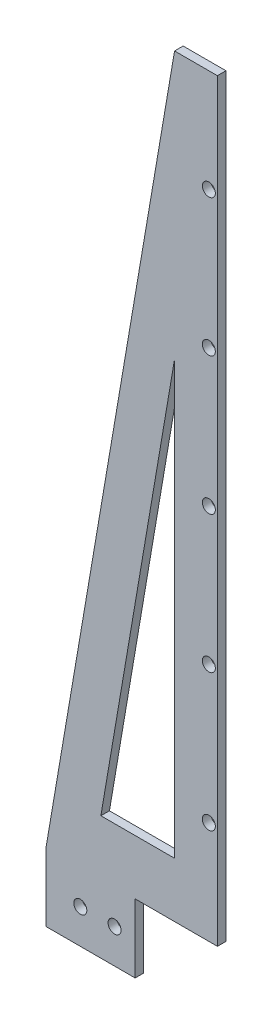
ISO-10303-21;
HEADER;
FILE_DESCRIPTION(('STEP AP214'),'2;1');
FILE_NAME('part.step','',(''),(''),'','','');
FILE_SCHEMA(('AUTOMOTIVE_DESIGN { 1 0 10303 214 1 1 1 1 }'));
ENDSEC;
DATA;
#1=APPLICATION_CONTEXT('core data for automotive mechanical design processes');
#2=APPLICATION_PROTOCOL_DEFINITION('international standard','automotive_design',2000,#1);
#3=PRODUCT_CONTEXT('',#1,'mechanical');
#4=PRODUCT('Part','Part','',(#3));
#5=PRODUCT_RELATED_PRODUCT_CATEGORY('part','',(#4));
#6=PRODUCT_DEFINITION_FORMATION('','',#4);
#7=PRODUCT_DEFINITION_CONTEXT('part definition',#1,'design');
#8=PRODUCT_DEFINITION('design','',#6,#7);
#9=PRODUCT_DEFINITION_SHAPE('','',#8);
#10=(LENGTH_UNIT() NAMED_UNIT(*) SI_UNIT(.MILLI.,.METRE.));
#11=(NAMED_UNIT(*) PLANE_ANGLE_UNIT() SI_UNIT($,.RADIAN.));
#12=(NAMED_UNIT(*) SI_UNIT($,.STERADIAN.) SOLID_ANGLE_UNIT());
#13=UNCERTAINTY_MEASURE_WITH_UNIT(LENGTH_MEASURE(1.E-05),#10,'distance_accuracy_value','');
#14=(GEOMETRIC_REPRESENTATION_CONTEXT(3) GLOBAL_UNCERTAINTY_ASSIGNED_CONTEXT((#13)) GLOBAL_UNIT_ASSIGNED_CONTEXT((#10,
#11,#12)) REPRESENTATION_CONTEXT('',''));
#15=CARTESIAN_POINT('',(0.,0.,0.));
#16=DIRECTION('',(0.,0.,1.));
#17=DIRECTION('',(1.,0.,0.));
#18=AXIS2_PLACEMENT_3D('',#15,#16,#17);
#19=CARTESIAN_POINT('',(0.,0.,3.175));
#20=DIRECTION('',(0.,0.,1.));
#21=DIRECTION('',(1.,0.,0.));
#22=AXIS2_PLACEMENT_3D('',#19,#20,#21);
#23=PLANE('',#22);
#24=CARTESIAN_POINT('',(60.3249999999997,165.1,3.175));
#25=DIRECTION('',(0.,0.,1.));
#26=DIRECTION('',(1.,0.,0.));
#27=AXIS2_PLACEMENT_3D('',#24,#25,#26);
#28=CIRCLE('',#27,2.41299999999999);
#29=CARTESIAN_POINT('',(62.7379999999997,165.1,3.175));
#30=VERTEX_POINT('',#29);
#31=EDGE_CURVE('E601',#30,#30,#28,.T.);
#32=ORIENTED_EDGE('',*,*,#31,.F.);
#33=EDGE_LOOP('',(#32));
#34=FACE_BOUND('',#33,.T.);
#35=CARTESIAN_POINT('',(60.325,63.5,3.175));
#36=DIRECTION('',(0.,0.,1.));
#37=DIRECTION('',(1.,0.,0.));
#38=AXIS2_PLACEMENT_3D('',#35,#36,#37);
#39=CIRCLE('',#38,2.41299999999999);
#40=CARTESIAN_POINT('',(62.738,63.5,3.175));
#41=VERTEX_POINT('',#40);
#42=EDGE_CURVE('E613',#41,#41,#39,.T.);
#43=ORIENTED_EDGE('',*,*,#42,.F.);
#44=EDGE_LOOP('',(#43));
#45=FACE_BOUND('',#44,.T.);
#46=CARTESIAN_POINT('',(25.4,12.7,3.175));
#47=DIRECTION('',(0.,0.,1.));
#48=DIRECTION('',(1.,0.,0.));
#49=AXIS2_PLACEMENT_3D('',#46,#47,#48);
#50=CIRCLE('',#49,2.413);
#51=CARTESIAN_POINT('',(27.813,12.7,3.175));
#52=VERTEX_POINT('',#51);
#53=EDGE_CURVE('E625',#52,#52,#50,.T.);
#54=ORIENTED_EDGE('',*,*,#53,.F.);
#55=EDGE_LOOP('',(#54));
#56=FACE_BOUND('',#55,.T.);
#57=DIRECTION('',(0.,1.,0.));
#58=VECTOR('',#57,1.);
#59=CARTESIAN_POINT('',(0.,0.,3.175));
#60=LINE('',#59,#58);
#61=CARTESIAN_POINT('',(0.,0.,3.175));
#62=VERTEX_POINT('',#61);
#63=CARTESIAN_POINT('',(0.,25.4,3.175));
#64=VERTEX_POINT('',#63);
#65=EDGE_CURVE('E342',#62,#64,#60,.T.);
#66=ORIENTED_EDGE('',*,*,#65,.F.);
#67=DIRECTION('',(1.,0.,0.));
#68=VECTOR('',#67,1.);
#69=CARTESIAN_POINT('',(0.,0.,3.175));
#70=LINE('',#69,#68);
#71=CARTESIAN_POINT('',(33.02,0.,3.175));
#72=VERTEX_POINT('',#71);
#73=EDGE_CURVE('E356',#62,#72,#70,.T.);
#74=ORIENTED_EDGE('',*,*,#73,.T.);
#75=DIRECTION('',(0.,1.,0.));
#76=VECTOR('',#75,1.);
#77=CARTESIAN_POINT('',(33.02,0.,3.175));
#78=LINE('',#77,#76);
#79=CARTESIAN_POINT('',(33.02,25.4,3.175));
#80=VERTEX_POINT('',#79);
#81=EDGE_CURVE('E354',#72,#80,#78,.T.);
#82=ORIENTED_EDGE('',*,*,#81,.T.);
#83=DIRECTION('',(1.,0.,0.));
#84=VECTOR('',#83,1.);
#85=CARTESIAN_POINT('',(33.02,25.4,3.175));
#86=LINE('',#85,#84);
#87=CARTESIAN_POINT('',(63.5,25.4,3.175));
#88=VERTEX_POINT('',#87);
#89=EDGE_CURVE('E352',#80,#88,#86,.T.);
#90=ORIENTED_EDGE('',*,*,#89,.T.);
#91=DIRECTION('',(0.,1.,0.));
#92=VECTOR('',#91,1.);
#93=CARTESIAN_POINT('',(63.5,25.4,3.175));
#94=LINE('',#93,#92);
#95=CARTESIAN_POINT('',(63.5,304.8,3.175));
#96=VERTEX_POINT('',#95);
#97=EDGE_CURVE('E350',#88,#96,#94,.T.);
#98=ORIENTED_EDGE('',*,*,#97,.T.);
#99=DIRECTION('',(-1.,0.,0.));
#100=VECTOR('',#99,1.);
#101=CARTESIAN_POINT('',(63.5,304.8,3.175));
#102=LINE('',#101,#100);
#103=CARTESIAN_POINT('',(47.625,304.8,3.175));
#104=VERTEX_POINT('',#103);
#105=EDGE_CURVE('E348',#96,#104,#102,.T.);
#106=ORIENTED_EDGE('',*,*,#105,.T.);
#107=DIRECTION('',(-0.168030974324044,-0.985781716034393,0.));
#108=VECTOR('',#107,1.);
#109=CARTESIAN_POINT('',(47.625,304.8,3.175));
#110=LINE('',#109,#108);
#111=EDGE_CURVE('E345',#104,#64,#110,.T.);
#112=ORIENTED_EDGE('',*,*,#111,.T.);
#113=EDGE_LOOP('',(#66,#74,#82,#90,#98,#106,#112));
#114=FACE_BOUND('',#113,.T.);
#115=DIRECTION('',(-1.,0.,0.));
#116=VECTOR('',#115,1.);
#117=CARTESIAN_POINT('',(47.625,45.72,3.175));
#118=LINE('',#117,#116);
#119=CARTESIAN_POINT('',(47.625,45.72,3.175));
#120=VERTEX_POINT('',#119);
#121=CARTESIAN_POINT('',(20.3199999999999,45.72,3.175));
#122=VERTEX_POINT('',#121);
#123=EDGE_CURVE('E313',#120,#122,#118,.T.);
#124=ORIENTED_EDGE('',*,*,#123,.T.);
#125=DIRECTION('',(0.168030974324052,0.985781716034392,0.));
#126=VECTOR('',#125,1.);
#127=CARTESIAN_POINT('',(20.3199999999999,45.72,3.175));
#128=LINE('',#127,#126);
#129=CARTESIAN_POINT('',(47.625,205.909333333327,3.175));
#130=VERTEX_POINT('',#129);
#131=EDGE_CURVE('E320',#122,#130,#128,.T.);
#132=ORIENTED_EDGE('',*,*,#131,.T.);
#133=DIRECTION('',(0.,-1.,0.));
#134=VECTOR('',#133,1.);
#135=CARTESIAN_POINT('',(47.625,205.909333333327,3.175));
#136=LINE('',#135,#134);
#137=EDGE_CURVE('E250',#130,#120,#136,.T.);
#138=ORIENTED_EDGE('',*,*,#137,.T.);
#139=EDGE_LOOP('',(#124,#132,#138));
#140=FACE_BOUND('',#139,.T.);
#141=CARTESIAN_POINT('',(12.7,12.7,3.175));
#142=DIRECTION('',(0.,0.,1.));
#143=DIRECTION('',(1.,0.,0.));
#144=AXIS2_PLACEMENT_3D('',#141,#142,#143);
#145=CIRCLE('',#144,2.413);
#146=CARTESIAN_POINT('',(15.113,12.7,3.175));
#147=VERTEX_POINT('',#146);
#148=EDGE_CURVE('E336',#147,#147,#145,.T.);
#149=ORIENTED_EDGE('',*,*,#148,.F.);
#150=EDGE_LOOP('',(#149));
#151=FACE_BOUND('',#150,.T.);
#152=CARTESIAN_POINT('',(60.3249999999998,114.3,3.175));
#153=DIRECTION('',(0.,0.,1.));
#154=DIRECTION('',(1.,0.,0.));
#155=AXIS2_PLACEMENT_3D('',#152,#153,#154);
#156=CIRCLE('',#155,2.41299999999999);
#157=CARTESIAN_POINT('',(62.7379999999998,114.3,3.175));
#158=VERTEX_POINT('',#157);
#159=EDGE_CURVE('E619',#158,#158,#156,.T.);
#160=ORIENTED_EDGE('',*,*,#159,.F.);
#161=EDGE_LOOP('',(#160));
#162=FACE_BOUND('',#161,.T.);
#163=CARTESIAN_POINT('',(60.3249999999995,215.9,3.175));
#164=DIRECTION('',(0.,0.,1.));
#165=DIRECTION('',(1.,0.,0.));
#166=AXIS2_PLACEMENT_3D('',#163,#164,#165);
#167=CIRCLE('',#166,2.41299999999999);
#168=CARTESIAN_POINT('',(62.7379999999995,215.9,3.175));
#169=VERTEX_POINT('',#168);
#170=EDGE_CURVE('E607',#169,#169,#167,.T.);
#171=ORIENTED_EDGE('',*,*,#170,.F.);
#172=EDGE_LOOP('',(#171));
#173=FACE_BOUND('',#172,.T.);
#174=CARTESIAN_POINT('',(60.3249999999993,266.7,3.175));
#175=DIRECTION('',(0.,0.,1.));
#176=DIRECTION('',(1.,0.,0.));
#177=AXIS2_PLACEMENT_3D('',#174,#175,#176);
#178=CIRCLE('',#177,2.413);
#179=CARTESIAN_POINT('',(62.7379999999993,266.7,3.175));
#180=VERTEX_POINT('',#179);
#181=EDGE_CURVE('E592',#180,#180,#178,.T.);
#182=ORIENTED_EDGE('',*,*,#181,.F.);
#183=EDGE_LOOP('',(#182));
#184=FACE_BOUND('',#183,.T.);
#185=ADVANCED_FACE('F233',(#34,#45,#56,#114,#140,#151,#162,#173,#184),#23,.T.);
#186=CARTESIAN_POINT('',(0.,0.,0.));
#187=DIRECTION('',(0.,0.,1.));
#188=DIRECTION('',(1.,0.,0.));
#189=AXIS2_PLACEMENT_3D('',#186,#187,#188);
#190=PLANE('',#189);
#191=DIRECTION('',(0.168030974324052,0.985781716034392,0.));
#192=VECTOR('',#191,1.);
#193=CARTESIAN_POINT('',(20.3199999999999,45.72,0.));
#194=LINE('',#193,#192);
#195=CARTESIAN_POINT('',(20.3199999999999,45.72,0.));
#196=VERTEX_POINT('',#195);
#197=CARTESIAN_POINT('',(47.625,205.909333333327,0.));
#198=VERTEX_POINT('',#197);
#199=EDGE_CURVE('E328',#196,#198,#194,.T.);
#200=ORIENTED_EDGE('',*,*,#199,.F.);
#201=DIRECTION('',(-1.,0.,0.));
#202=VECTOR('',#201,1.);
#203=CARTESIAN_POINT('',(47.625,45.72,0.));
#204=LINE('',#203,#202);
#205=CARTESIAN_POINT('',(47.625,45.72,0.));
#206=VERTEX_POINT('',#205);
#207=EDGE_CURVE('E258',#206,#196,#204,.T.);
#208=ORIENTED_EDGE('',*,*,#207,.F.);
#209=DIRECTION('',(0.,-1.,0.));
#210=VECTOR('',#209,1.);
#211=CARTESIAN_POINT('',(47.625,205.909333333327,0.));
#212=LINE('',#211,#210);
#213=EDGE_CURVE('E325',#198,#206,#212,.T.);
#214=ORIENTED_EDGE('',*,*,#213,.F.);
#215=EDGE_LOOP('',(#200,#208,#214));
#216=FACE_BOUND('',#215,.T.);
#217=DIRECTION('',(0.,1.,0.));
#218=VECTOR('',#217,1.);
#219=CARTESIAN_POINT('',(0.,0.,0.));
#220=LINE('',#219,#218);
#221=CARTESIAN_POINT('',(0.,0.,0.));
#222=VERTEX_POINT('',#221);
#223=CARTESIAN_POINT('',(0.,25.4,0.));
#224=VERTEX_POINT('',#223);
#225=EDGE_CURVE('E340',#222,#224,#220,.T.);
#226=ORIENTED_EDGE('',*,*,#225,.T.);
#227=DIRECTION('',(-0.168030974324044,-0.985781716034393,0.));
#228=VECTOR('',#227,1.);
#229=CARTESIAN_POINT('',(47.625,304.8,0.));
#230=LINE('',#229,#228);
#231=CARTESIAN_POINT('',(47.625,304.8,0.));
#232=VERTEX_POINT('',#231);
#233=EDGE_CURVE('E360',#232,#224,#230,.T.);
#234=ORIENTED_EDGE('',*,*,#233,.F.);
#235=DIRECTION('',(-1.,0.,0.));
#236=VECTOR('',#235,1.);
#237=CARTESIAN_POINT('',(63.5,304.8,0.));
#238=LINE('',#237,#236);
#239=CARTESIAN_POINT('',(63.5,304.8,0.));
#240=VERTEX_POINT('',#239);
#241=EDGE_CURVE('E363',#240,#232,#238,.T.);
#242=ORIENTED_EDGE('',*,*,#241,.F.);
#243=DIRECTION('',(0.,1.,0.));
#244=VECTOR('',#243,1.);
#245=CARTESIAN_POINT('',(63.5,25.4,0.));
#246=LINE('',#245,#244);
#247=CARTESIAN_POINT('',(63.5,25.4,0.));
#248=VERTEX_POINT('',#247);
#249=EDGE_CURVE('E365',#248,#240,#246,.T.);
#250=ORIENTED_EDGE('',*,*,#249,.F.);
#251=DIRECTION('',(1.,0.,0.));
#252=VECTOR('',#251,1.);
#253=CARTESIAN_POINT('',(33.02,25.4,0.));
#254=LINE('',#253,#252);
#255=CARTESIAN_POINT('',(33.02,25.4,0.));
#256=VERTEX_POINT('',#255);
#257=EDGE_CURVE('E367',#256,#248,#254,.T.);
#258=ORIENTED_EDGE('',*,*,#257,.F.);
#259=DIRECTION('',(0.,1.,0.));
#260=VECTOR('',#259,1.);
#261=CARTESIAN_POINT('',(33.02,0.,0.));
#262=LINE('',#261,#260);
#263=CARTESIAN_POINT('',(33.02,0.,0.));
#264=VERTEX_POINT('',#263);
#265=EDGE_CURVE('E369',#264,#256,#262,.T.);
#266=ORIENTED_EDGE('',*,*,#265,.F.);
#267=DIRECTION('',(1.,0.,0.));
#268=VECTOR('',#267,1.);
#269=CARTESIAN_POINT('',(0.,0.,0.));
#270=LINE('',#269,#268);
#271=EDGE_CURVE('E346',#222,#264,#270,.T.);
#272=ORIENTED_EDGE('',*,*,#271,.F.);
#273=EDGE_LOOP('',(#226,#234,#242,#250,#258,#266,#272));
#274=FACE_BOUND('',#273,.T.);
#275=CARTESIAN_POINT('',(12.7,12.7,0.));
#276=DIRECTION('',(0.,0.,1.));
#277=DIRECTION('',(1.,0.,0.));
#278=AXIS2_PLACEMENT_3D('',#275,#276,#277);
#279=CIRCLE('',#278,2.413);
#280=CARTESIAN_POINT('',(15.113,12.7,0.));
#281=VERTEX_POINT('',#280);
#282=EDGE_CURVE('E331',#281,#281,#279,.T.);
#283=ORIENTED_EDGE('',*,*,#282,.T.);
#284=EDGE_LOOP('',(#283));
#285=FACE_BOUND('',#284,.T.);
#286=CARTESIAN_POINT('',(25.4,12.7,0.));
#287=DIRECTION('',(0.,0.,1.));
#288=DIRECTION('',(1.,0.,0.));
#289=AXIS2_PLACEMENT_3D('',#286,#287,#288);
#290=CIRCLE('',#289,2.413);
#291=CARTESIAN_POINT('',(27.813,12.7,0.));
#292=VERTEX_POINT('',#291);
#293=EDGE_CURVE('E622',#292,#292,#290,.T.);
#294=ORIENTED_EDGE('',*,*,#293,.T.);
#295=EDGE_LOOP('',(#294));
#296=FACE_BOUND('',#295,.T.);
#297=CARTESIAN_POINT('',(60.3249999999998,114.3,0.));
#298=DIRECTION('',(0.,0.,1.));
#299=DIRECTION('',(1.,0.,0.));
#300=AXIS2_PLACEMENT_3D('',#297,#298,#299);
#301=CIRCLE('',#300,2.41299999999999);
#302=CARTESIAN_POINT('',(62.7379999999998,114.3,0.));
#303=VERTEX_POINT('',#302);
#304=EDGE_CURVE('E616',#303,#303,#301,.T.);
#305=ORIENTED_EDGE('',*,*,#304,.T.);
#306=EDGE_LOOP('',(#305));
#307=FACE_BOUND('',#306,.T.);
#308=CARTESIAN_POINT('',(60.325,63.5,0.));
#309=DIRECTION('',(0.,0.,1.));
#310=DIRECTION('',(1.,0.,0.));
#311=AXIS2_PLACEMENT_3D('',#308,#309,#310);
#312=CIRCLE('',#311,2.41299999999999);
#313=CARTESIAN_POINT('',(62.738,63.5,0.));
#314=VERTEX_POINT('',#313);
#315=EDGE_CURVE('E610',#314,#314,#312,.T.);
#316=ORIENTED_EDGE('',*,*,#315,.T.);
#317=EDGE_LOOP('',(#316));
#318=FACE_BOUND('',#317,.T.);
#319=CARTESIAN_POINT('',(60.3249999999995,215.9,0.));
#320=DIRECTION('',(0.,0.,1.));
#321=DIRECTION('',(1.,0.,0.));
#322=AXIS2_PLACEMENT_3D('',#319,#320,#321);
#323=CIRCLE('',#322,2.41299999999999);
#324=CARTESIAN_POINT('',(62.7379999999995,215.9,0.));
#325=VERTEX_POINT('',#324);
#326=EDGE_CURVE('E604',#325,#325,#323,.T.);
#327=ORIENTED_EDGE('',*,*,#326,.T.);
#328=EDGE_LOOP('',(#327));
#329=FACE_BOUND('',#328,.T.);
#330=CARTESIAN_POINT('',(60.3249999999997,165.1,0.));
#331=DIRECTION('',(0.,0.,1.));
#332=DIRECTION('',(1.,0.,0.));
#333=AXIS2_PLACEMENT_3D('',#330,#331,#332);
#334=CIRCLE('',#333,2.41299999999999);
#335=CARTESIAN_POINT('',(62.7379999999997,165.1,0.));
#336=VERTEX_POINT('',#335);
#337=EDGE_CURVE('E598',#336,#336,#334,.T.);
#338=ORIENTED_EDGE('',*,*,#337,.T.);
#339=EDGE_LOOP('',(#338));
#340=FACE_BOUND('',#339,.T.);
#341=CARTESIAN_POINT('',(60.3249999999993,266.7,0.));
#342=DIRECTION('',(0.,0.,1.));
#343=DIRECTION('',(1.,0.,0.));
#344=AXIS2_PLACEMENT_3D('',#341,#342,#343);
#345=CIRCLE('',#344,2.413);
#346=CARTESIAN_POINT('',(62.7379999999993,266.7,0.));
#347=VERTEX_POINT('',#346);
#348=EDGE_CURVE('E595',#347,#347,#345,.T.);
#349=ORIENTED_EDGE('',*,*,#348,.T.);
#350=EDGE_LOOP('',(#349));
#351=FACE_BOUND('',#350,.T.);
#352=ADVANCED_FACE('F396',(#216,#274,#285,#296,#307,#318,#329,#340,#351),#190,.F.);
#353=CARTESIAN_POINT('',(0.,0.,3.175));
#354=DIRECTION('',(-1.,0.,0.));
#355=DIRECTION('',(0.,0.,1.));
#356=AXIS2_PLACEMENT_3D('',#353,#354,#355);
#357=PLANE('',#356);
#358=ORIENTED_EDGE('',*,*,#225,.F.);
#359=DIRECTION('',(0.,0.,-1.));
#360=VECTOR('',#359,1.);
#361=CARTESIAN_POINT('',(0.,0.,3.175));
#362=LINE('',#361,#360);
#363=EDGE_CURVE('E12',#62,#222,#362,.T.);
#364=ORIENTED_EDGE('',*,*,#363,.F.);
#365=ORIENTED_EDGE('',*,*,#65,.T.);
#366=DIRECTION('',(0.,0.,-1.));
#367=VECTOR('',#366,1.);
#368=CARTESIAN_POINT('',(0.,25.4,3.175));
#369=LINE('',#368,#367);
#370=EDGE_CURVE('E237',#64,#224,#369,.T.);
#371=ORIENTED_EDGE('',*,*,#370,.T.);
#372=EDGE_LOOP('',(#358,#364,#365,#371));
#373=FACE_BOUND('',#372,.T.);
#374=ADVANCED_FACE('F235',(#373),#357,.T.);
#375=CARTESIAN_POINT('',(0.,0.,3.175));
#376=DIRECTION('',(0.,1.,0.));
#377=DIRECTION('',(0.,0.,1.));
#378=AXIS2_PLACEMENT_3D('',#375,#376,#377);
#379=PLANE('',#378);
#380=ORIENTED_EDGE('',*,*,#271,.T.);
#381=DIRECTION('',(0.,0.,-1.));
#382=VECTOR('',#381,1.);
#383=CARTESIAN_POINT('',(33.02,0.,3.175));
#384=LINE('',#383,#382);
#385=EDGE_CURVE('E242',#72,#264,#384,.T.);
#386=ORIENTED_EDGE('',*,*,#385,.F.);
#387=ORIENTED_EDGE('',*,*,#73,.F.);
#388=ORIENTED_EDGE('',*,*,#363,.T.);
#389=EDGE_LOOP('',(#380,#386,#387,#388));
#390=FACE_BOUND('',#389,.T.);
#391=ADVANCED_FACE('F402',(#390),#379,.F.);
#392=CARTESIAN_POINT('',(33.02,0.,3.175));
#393=DIRECTION('',(-1.,0.,0.));
#394=DIRECTION('',(0.,0.,1.));
#395=AXIS2_PLACEMENT_3D('',#392,#393,#394);
#396=PLANE('',#395);
#397=ORIENTED_EDGE('',*,*,#265,.T.);
#398=DIRECTION('',(0.,0.,-1.));
#399=VECTOR('',#398,1.);
#400=CARTESIAN_POINT('',(33.02,25.4,3.175));
#401=LINE('',#400,#399);
#402=EDGE_CURVE('E374',#80,#256,#401,.T.);
#403=ORIENTED_EDGE('',*,*,#402,.F.);
#404=ORIENTED_EDGE('',*,*,#81,.F.);
#405=ORIENTED_EDGE('',*,*,#385,.T.);
#406=EDGE_LOOP('',(#397,#403,#404,#405));
#407=FACE_BOUND('',#406,.T.);
#408=ADVANCED_FACE('F406',(#407),#396,.F.);
#409=CARTESIAN_POINT('',(33.02,25.4,3.175));
#410=DIRECTION('',(0.,1.,0.));
#411=DIRECTION('',(-1.,0.,0.));
#412=AXIS2_PLACEMENT_3D('',#409,#410,#411);
#413=PLANE('',#412);
#414=ORIENTED_EDGE('',*,*,#257,.T.);
#415=DIRECTION('',(0.,0.,-1.));
#416=VECTOR('',#415,1.);
#417=CARTESIAN_POINT('',(63.5,25.4,3.175));
#418=LINE('',#417,#416);
#419=EDGE_CURVE('E377',#88,#248,#418,.T.);
#420=ORIENTED_EDGE('',*,*,#419,.F.);
#421=ORIENTED_EDGE('',*,*,#89,.F.);
#422=ORIENTED_EDGE('',*,*,#402,.T.);
#423=EDGE_LOOP('',(#414,#420,#421,#422));
#424=FACE_BOUND('',#423,.T.);
#425=ADVANCED_FACE('F420',(#424),#413,.F.);
#426=CARTESIAN_POINT('',(63.5,25.4,3.175));
#427=DIRECTION('',(-1.,0.,0.));
#428=DIRECTION('',(0.,0.,1.));
#429=AXIS2_PLACEMENT_3D('',#426,#427,#428);
#430=PLANE('',#429);
#431=ORIENTED_EDGE('',*,*,#249,.T.);
#432=DIRECTION('',(0.,0.,-1.));
#433=VECTOR('',#432,1.);
#434=CARTESIAN_POINT('',(63.5,304.8,3.175));
#435=LINE('',#434,#433);
#436=EDGE_CURVE('E380',#96,#240,#435,.T.);
#437=ORIENTED_EDGE('',*,*,#436,.F.);
#438=ORIENTED_EDGE('',*,*,#97,.F.);
#439=ORIENTED_EDGE('',*,*,#419,.T.);
#440=EDGE_LOOP('',(#431,#437,#438,#439));
#441=FACE_BOUND('',#440,.T.);
#442=ADVANCED_FACE('F418',(#441),#430,.F.);
#443=CARTESIAN_POINT('',(63.5,304.8,3.175));
#444=DIRECTION('',(0.,-1.,0.));
#445=DIRECTION('',(0.,0.,-1.));
#446=AXIS2_PLACEMENT_3D('',#443,#444,#445);
#447=PLANE('',#446);
#448=ORIENTED_EDGE('',*,*,#241,.T.);
#449=DIRECTION('',(0.,0.,-1.));
#450=VECTOR('',#449,1.);
#451=CARTESIAN_POINT('',(47.625,304.8,3.175));
#452=LINE('',#451,#450);
#453=EDGE_CURVE('E382',#104,#232,#452,.T.);
#454=ORIENTED_EDGE('',*,*,#453,.F.);
#455=ORIENTED_EDGE('',*,*,#105,.F.);
#456=ORIENTED_EDGE('',*,*,#436,.T.);
#457=EDGE_LOOP('',(#448,#454,#455,#456));
#458=FACE_BOUND('',#457,.T.);
#459=ADVANCED_FACE('F415',(#458),#447,.F.);
#460=CARTESIAN_POINT('',(47.625,304.8,3.175));
#461=DIRECTION('',(0.985781716034393,-0.168030974324044,0.));
#462=DIRECTION('',(0.168030974324044,0.985781716034393,0.));
#463=AXIS2_PLACEMENT_3D('',#460,#461,#462);
#464=PLANE('',#463);
#465=ORIENTED_EDGE('',*,*,#233,.T.);
#466=ORIENTED_EDGE('',*,*,#370,.F.);
#467=ORIENTED_EDGE('',*,*,#111,.F.);
#468=ORIENTED_EDGE('',*,*,#453,.T.);
#469=EDGE_LOOP('',(#465,#466,#467,#468));
#470=FACE_BOUND('',#469,.T.);
#471=ADVANCED_FACE('F392',(#470),#464,.F.);
#472=CARTESIAN_POINT('',(47.625,45.72,3.175));
#473=DIRECTION('',(0.,-1.,0.));
#474=DIRECTION('',(0.,0.,-1.));
#475=AXIS2_PLACEMENT_3D('',#472,#473,#474);
#476=PLANE('',#475);
#477=ORIENTED_EDGE('',*,*,#207,.T.);
#478=DIRECTION('',(0.,0.,-1.));
#479=VECTOR('',#478,1.);
#480=CARTESIAN_POINT('',(20.3199999999999,45.72,3.175));
#481=LINE('',#480,#479);
#482=EDGE_CURVE('E309',#122,#196,#481,.T.);
#483=ORIENTED_EDGE('',*,*,#482,.F.);
#484=ORIENTED_EDGE('',*,*,#123,.F.);
#485=DIRECTION('',(0.,0.,-1.));
#486=VECTOR('',#485,1.);
#487=CARTESIAN_POINT('',(47.625,45.72,3.175));
#488=LINE('',#487,#486);
#489=EDGE_CURVE('E338',#120,#206,#488,.T.);
#490=ORIENTED_EDGE('',*,*,#489,.T.);
#491=EDGE_LOOP('',(#477,#483,#484,#490));
#492=FACE_BOUND('',#491,.T.);
#493=ADVANCED_FACE('F311',(#492),#476,.F.);
#494=CARTESIAN_POINT('',(47.625,205.909333333327,3.175));
#495=DIRECTION('',(1.,0.,0.));
#496=DIRECTION('',(0.,1.,0.));
#497=AXIS2_PLACEMENT_3D('',#494,#495,#496);
#498=PLANE('',#497);
#499=ORIENTED_EDGE('',*,*,#213,.T.);
#500=ORIENTED_EDGE('',*,*,#489,.F.);
#501=ORIENTED_EDGE('',*,*,#137,.F.);
#502=DIRECTION('',(0.,0.,-1.));
#503=VECTOR('',#502,1.);
#504=CARTESIAN_POINT('',(47.625,205.909333333327,3.175));
#505=LINE('',#504,#503);
#506=EDGE_CURVE('E317',#130,#198,#505,.T.);
#507=ORIENTED_EDGE('',*,*,#506,.T.);
#508=EDGE_LOOP('',(#499,#500,#501,#507));
#509=FACE_BOUND('',#508,.T.);
#510=ADVANCED_FACE('F499',(#509),#498,.F.);
#511=CARTESIAN_POINT('',(20.3199999999999,45.72,3.175));
#512=DIRECTION('',(-0.985781716034391,0.168030974324052,0.));
#513=DIRECTION('',(-0.168030974324052,-0.985781716034392,0.));
#514=AXIS2_PLACEMENT_3D('',#511,#512,#513);
#515=PLANE('',#514);
#516=ORIENTED_EDGE('',*,*,#199,.T.);
#517=ORIENTED_EDGE('',*,*,#506,.F.);
#518=ORIENTED_EDGE('',*,*,#131,.F.);
#519=ORIENTED_EDGE('',*,*,#482,.T.);
#520=EDGE_LOOP('',(#516,#517,#518,#519));
#521=FACE_BOUND('',#520,.T.);
#522=ADVANCED_FACE('F321',(#521),#515,.F.);
#523=CARTESIAN_POINT('',(12.7,12.7,3.175));
#524=DIRECTION('',(0.,0.,-1.));
#525=DIRECTION('',(-1.,0.,0.));
#526=AXIS2_PLACEMENT_3D('',#523,#524,#525);
#527=CYLINDRICAL_SURFACE('',#526,2.413);
#528=ORIENTED_EDGE('',*,*,#148,.T.);
#529=EDGE_LOOP('',(#528));
#530=FACE_BOUND('',#529,.T.);
#531=ORIENTED_EDGE('',*,*,#282,.F.);
#532=EDGE_LOOP('',(#531));
#533=FACE_BOUND('',#532,.T.);
#534=ADVANCED_FACE('F513',(#530,#533),#527,.F.);
#535=CARTESIAN_POINT('',(25.4,12.7,3.175));
#536=DIRECTION('',(0.,0.,-1.));
#537=DIRECTION('',(-1.,0.,0.));
#538=AXIS2_PLACEMENT_3D('',#535,#536,#537);
#539=CYLINDRICAL_SURFACE('',#538,2.413);
#540=ORIENTED_EDGE('',*,*,#53,.T.);
#541=EDGE_LOOP('',(#540));
#542=FACE_BOUND('',#541,.T.);
#543=ORIENTED_EDGE('',*,*,#293,.F.);
#544=EDGE_LOOP('',(#543));
#545=FACE_BOUND('',#544,.T.);
#546=ADVANCED_FACE('F520',(#542,#545),#539,.F.);
#547=CARTESIAN_POINT('',(60.3249999999998,114.3,3.175));
#548=DIRECTION('',(0.,0.,-1.));
#549=DIRECTION('',(-1.,0.,0.));
#550=AXIS2_PLACEMENT_3D('',#547,#548,#549);
#551=CYLINDRICAL_SURFACE('',#550,2.41299999999999);
#552=ORIENTED_EDGE('',*,*,#159,.T.);
#553=EDGE_LOOP('',(#552));
#554=FACE_BOUND('',#553,.T.);
#555=ORIENTED_EDGE('',*,*,#304,.F.);
#556=EDGE_LOOP('',(#555));
#557=FACE_BOUND('',#556,.T.);
#558=ADVANCED_FACE('F529',(#554,#557),#551,.F.);
#559=CARTESIAN_POINT('',(60.325,63.5,3.175));
#560=DIRECTION('',(0.,0.,-1.));
#561=DIRECTION('',(-1.,0.,0.));
#562=AXIS2_PLACEMENT_3D('',#559,#560,#561);
#563=CYLINDRICAL_SURFACE('',#562,2.41299999999999);
#564=ORIENTED_EDGE('',*,*,#42,.T.);
#565=EDGE_LOOP('',(#564));
#566=FACE_BOUND('',#565,.T.);
#567=ORIENTED_EDGE('',*,*,#315,.F.);
#568=EDGE_LOOP('',(#567));
#569=FACE_BOUND('',#568,.T.);
#570=ADVANCED_FACE('F538',(#566,#569),#563,.F.);
#571=CARTESIAN_POINT('',(60.3249999999995,215.9,3.175));
#572=DIRECTION('',(0.,0.,-1.));
#573=DIRECTION('',(-1.,0.,0.));
#574=AXIS2_PLACEMENT_3D('',#571,#572,#573);
#575=CYLINDRICAL_SURFACE('',#574,2.41299999999999);
#576=ORIENTED_EDGE('',*,*,#170,.T.);
#577=EDGE_LOOP('',(#576));
#578=FACE_BOUND('',#577,.T.);
#579=ORIENTED_EDGE('',*,*,#326,.F.);
#580=EDGE_LOOP('',(#579));
#581=FACE_BOUND('',#580,.T.);
#582=ADVANCED_FACE('F547',(#578,#581),#575,.F.);
#583=CARTESIAN_POINT('',(60.3249999999997,165.1,3.175));
#584=DIRECTION('',(0.,0.,-1.));
#585=DIRECTION('',(-1.,0.,0.));
#586=AXIS2_PLACEMENT_3D('',#583,#584,#585);
#587=CYLINDRICAL_SURFACE('',#586,2.41299999999999);
#588=ORIENTED_EDGE('',*,*,#31,.T.);
#589=EDGE_LOOP('',(#588));
#590=FACE_BOUND('',#589,.T.);
#591=ORIENTED_EDGE('',*,*,#337,.F.);
#592=EDGE_LOOP('',(#591));
#593=FACE_BOUND('',#592,.T.);
#594=ADVANCED_FACE('F556',(#590,#593),#587,.F.);
#595=CARTESIAN_POINT('',(60.3249999999993,266.7,3.175));
#596=DIRECTION('',(0.,0.,-1.));
#597=DIRECTION('',(-1.,0.,0.));
#598=AXIS2_PLACEMENT_3D('',#595,#596,#597);
#599=CYLINDRICAL_SURFACE('',#598,2.413);
#600=ORIENTED_EDGE('',*,*,#181,.T.);
#601=EDGE_LOOP('',(#600));
#602=FACE_BOUND('',#601,.T.);
#603=ORIENTED_EDGE('',*,*,#348,.F.);
#604=EDGE_LOOP('',(#603));
#605=FACE_BOUND('',#604,.T.);
#606=ADVANCED_FACE('F565',(#602,#605),#599,.F.);
#607=CLOSED_SHELL('',(#185,#352,#374,#391,#408,#425,#442,#459,#471,#493,#510,#522,#534,#546,
#558,#570,#582,#594,#606));
#608=MANIFOLD_SOLID_BREP('B2',#607);
#609=ADVANCED_BREP_SHAPE_REPRESENTATION('',(#18,#608),#14);
#610=SHAPE_DEFINITION_REPRESENTATION(#9,#609);
ENDSEC;
END-ISO-10303-21;
